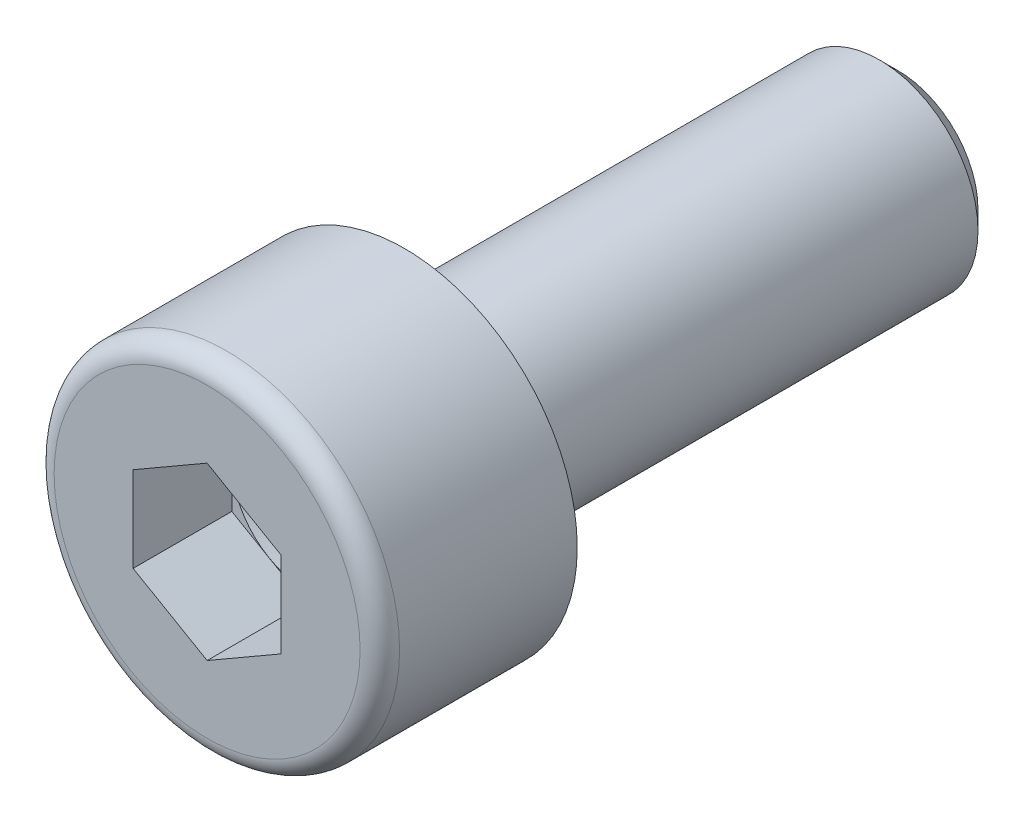
ISO-10303-21;
HEADER;
FILE_DESCRIPTION(('STEP AP214'),'2;1');
FILE_NAME('part.step','',(''),(''),'','','');
FILE_SCHEMA(('AUTOMOTIVE_DESIGN { 1 0 10303 214 1 1 1 1 }'));
ENDSEC;
DATA;
#1=APPLICATION_CONTEXT('core data for automotive mechanical design processes');
#2=APPLICATION_PROTOCOL_DEFINITION('international standard','automotive_design',2000,#1);
#3=PRODUCT_CONTEXT('',#1,'mechanical');
#4=PRODUCT('Part','Part','',(#3));
#5=PRODUCT_RELATED_PRODUCT_CATEGORY('part','',(#4));
#6=PRODUCT_DEFINITION_FORMATION('','',#4);
#7=PRODUCT_DEFINITION_CONTEXT('part definition',#1,'design');
#8=PRODUCT_DEFINITION('design','',#6,#7);
#9=PRODUCT_DEFINITION_SHAPE('','',#8);
#10=(LENGTH_UNIT() NAMED_UNIT(*) SI_UNIT(.MILLI.,.METRE.));
#11=(NAMED_UNIT(*) PLANE_ANGLE_UNIT() SI_UNIT($,.RADIAN.));
#12=(NAMED_UNIT(*) SI_UNIT($,.STERADIAN.) SOLID_ANGLE_UNIT());
#13=UNCERTAINTY_MEASURE_WITH_UNIT(LENGTH_MEASURE(1.E-05),#10,'distance_accuracy_value','');
#14=(GEOMETRIC_REPRESENTATION_CONTEXT(3) GLOBAL_UNCERTAINTY_ASSIGNED_CONTEXT((#13)) GLOBAL_UNIT_ASSIGNED_CONTEXT((#10,
#11,#12)) REPRESENTATION_CONTEXT('',''));
#15=CARTESIAN_POINT('',(0.,0.,0.));
#16=DIRECTION('',(0.,0.,1.));
#17=DIRECTION('',(1.,0.,0.));
#18=AXIS2_PLACEMENT_3D('',#15,#16,#17);
#19=CARTESIAN_POINT('',(0.,0.,-13.6211138875));
#20=DIRECTION('',(0.,0.,1.));
#21=DIRECTION('',(1.,0.,0.));
#22=AXIS2_PLACEMENT_3D('',#19,#20,#21);
#23=CONICAL_SURFACE('',#22,2.,0.785398163397448);
#24=CARTESIAN_POINT('',(0.,0.,-13.6211138875));
#25=DIRECTION('',(0.,0.,1.));
#26=DIRECTION('',(1.,0.,0.));
#27=AXIS2_PLACEMENT_3D('',#24,#25,#26);
#28=CIRCLE('',#27,2.);
#29=CARTESIAN_POINT('',(2.,0.,-13.6211138875));
#30=VERTEX_POINT('',#29);
#31=EDGE_CURVE('E202',#30,#30,#28,.T.);
#32=ORIENTED_EDGE('',*,*,#31,.F.);
#33=EDGE_LOOP('',(#32));
#34=FACE_BOUND('',#33,.T.);
#35=CARTESIAN_POINT('',(0.,0.,-14.));
#36=DIRECTION('',(0.,0.,-1.));
#37=DIRECTION('',(1.,0.,0.));
#38=AXIS2_PLACEMENT_3D('',#35,#36,#37);
#39=CIRCLE('',#38,1.6211138875);
#40=CARTESIAN_POINT('',(1.6211138875,0.,-14.));
#41=VERTEX_POINT('',#40);
#42=EDGE_CURVE('E280',#41,#41,#39,.T.);
#43=ORIENTED_EDGE('',*,*,#42,.F.);
#44=EDGE_LOOP('',(#43));
#45=FACE_BOUND('',#44,.T.);
#46=ADVANCED_FACE('F17',(#34,#45),#23,.T.);
#47=CARTESIAN_POINT('',(0.,0.,-4.2));
#48=DIRECTION('',(0.,0.,1.));
#49=DIRECTION('',(1.,0.,0.));
#50=AXIS2_PLACEMENT_3D('',#47,#48,#49);
#51=TOROIDAL_SURFACE('',#50,2.46487406649083,0.2);
#52=CARTESIAN_POINT('',(0.,0.,-4.));
#53=DIRECTION('',(0.,0.,1.));
#54=DIRECTION('',(1.,0.,0.));
#55=AXIS2_PLACEMENT_3D('',#52,#53,#54);
#56=CIRCLE('',#55,2.46487406649083);
#57=CARTESIAN_POINT('',(2.46487406649083,0.,-4.));
#58=VERTEX_POINT('',#57);
#59=EDGE_CURVE('E206',#58,#58,#56,.T.);
#60=ORIENTED_EDGE('',*,*,#59,.F.);
#61=EDGE_LOOP('',(#60));
#62=FACE_BOUND('',#61,.T.);
#63=CARTESIAN_POINT('',(0.,0.,-4.09922579489519));
#64=DIRECTION('',(0.,0.,-1.));
#65=DIRECTION('',(1.,0.,0.));
#66=AXIS2_PLACEMENT_3D('',#63,#64,#65);
#67=CIRCLE('',#66,2.29211828631114);
#68=CARTESIAN_POINT('',(2.29211828631114,0.,-4.09922579489519));
#69=VERTEX_POINT('',#68);
#70=EDGE_CURVE('E11',#69,#69,#67,.T.);
#71=ORIENTED_EDGE('',*,*,#70,.F.);
#72=EDGE_LOOP('',(#71));
#73=FACE_BOUND('',#72,.T.);
#74=ADVANCED_FACE('F19',(#62,#73),#51,.F.);
#75=CARTESIAN_POINT('',(0.,0.,-4.65406982827));
#76=DIRECTION('',(0.,0.,-1.));
#77=DIRECTION('',(-1.,0.,0.));
#78=AXIS2_PLACEMENT_3D('',#75,#76,#77);
#79=TOROIDAL_SURFACE('',#78,2.2,0.2);
#80=CARTESIAN_POINT('',(0.,0.,-4.65406982827));
#81=DIRECTION('',(0.,0.,-1.));
#82=DIRECTION('',(-1.,0.,0.));
#83=AXIS2_PLACEMENT_3D('',#80,#81,#82);
#84=CIRCLE('',#83,2.);
#85=CARTESIAN_POINT('',(-2.,0.,-4.65406982827));
#86=VERTEX_POINT('',#85);
#87=EDGE_CURVE('E205',#86,#86,#84,.T.);
#88=ORIENTED_EDGE('',*,*,#87,.F.);
#89=EDGE_LOOP('',(#88));
#90=FACE_BOUND('',#89,.T.);
#91=CARTESIAN_POINT('',(0.,0.,-4.55329562316518));
#92=DIRECTION('',(0.,0.,1.));
#93=DIRECTION('',(1.,0.,0.));
#94=AXIS2_PLACEMENT_3D('',#91,#92,#93);
#95=CIRCLE('',#94,2.02724421982031);
#96=CARTESIAN_POINT('',(2.02724421982031,0.,-4.55329562316518));
#97=VERTEX_POINT('',#96);
#98=EDGE_CURVE('E27',#97,#97,#95,.T.);
#99=ORIENTED_EDGE('',*,*,#98,.F.);
#100=EDGE_LOOP('',(#99));
#101=FACE_BOUND('',#100,.T.);
#102=ADVANCED_FACE('F353',(#90,#101),#79,.F.);
#103=CARTESIAN_POINT('',(0.,0.,-4.));
#104=DIRECTION('',(0.,0.,1.));
#105=DIRECTION('',(1.,0.,0.));
#106=AXIS2_PLACEMENT_3D('',#103,#104,#105);
#107=CONICAL_SURFACE('',#106,2.35,0.528074448426359);
#108=ORIENTED_EDGE('',*,*,#70,.T.);
#109=EDGE_LOOP('',(#108));
#110=FACE_BOUND('',#109,.T.);
#111=ORIENTED_EDGE('',*,*,#98,.T.);
#112=EDGE_LOOP('',(#111));
#113=FACE_BOUND('',#112,.T.);
#114=ADVANCED_FACE('F362',(#110,#113),#107,.T.);
#115=CARTESIAN_POINT('',(0.,0.,-2.));
#116=DIRECTION('',(0.,0.,1.));
#117=DIRECTION('',(1.,0.,0.));
#118=AXIS2_PLACEMENT_3D('',#115,#116,#117);
#119=CONICAL_SURFACE('',#118,1.5,1.22173047639603);
#120=CARTESIAN_POINT('',(0.,0.,-2.));
#121=DIRECTION('',(0.,0.,-1.));
#122=DIRECTION('',(-1.,0.,0.));
#123=AXIS2_PLACEMENT_3D('',#120,#121,#122);
#124=CIRCLE('',#123,1.5);
#125=CARTESIAN_POINT('',(-1.5,0.,-2.));
#126=VERTEX_POINT('',#125);
#127=CARTESIAN_POINT('',(-0.75,1.29903810567666,-2.));
#128=VERTEX_POINT('',#127);
#129=EDGE_CURVE('E170',#126,#128,#124,.T.);
#130=ORIENTED_EDGE('',*,*,#129,.F.);
#131=CARTESIAN_POINT('',(0.,0.,-2.));
#132=DIRECTION('',(0.,0.,-1.));
#133=DIRECTION('',(-1.,0.,0.));
#134=AXIS2_PLACEMENT_3D('',#131,#132,#133);
#135=CIRCLE('',#134,1.5);
#136=CARTESIAN_POINT('',(-0.75,-1.29903810567666,-2.));
#137=VERTEX_POINT('',#136);
#138=EDGE_CURVE('E21',#137,#126,#135,.T.);
#139=ORIENTED_EDGE('',*,*,#138,.F.);
#140=CARTESIAN_POINT('',(0.,0.,-2.));
#141=DIRECTION('',(0.,0.,-1.));
#142=DIRECTION('',(-1.,0.,0.));
#143=AXIS2_PLACEMENT_3D('',#140,#141,#142);
#144=CIRCLE('',#143,1.5);
#145=CARTESIAN_POINT('',(0.75,-1.29903810567666,-2.));
#146=VERTEX_POINT('',#145);
#147=EDGE_CURVE('E227',#146,#137,#144,.T.);
#148=ORIENTED_EDGE('',*,*,#147,.F.);
#149=CARTESIAN_POINT('',(0.,0.,-2.));
#150=DIRECTION('',(0.,0.,-1.));
#151=DIRECTION('',(-1.,0.,0.));
#152=AXIS2_PLACEMENT_3D('',#149,#150,#151);
#153=CIRCLE('',#152,1.5);
#154=CARTESIAN_POINT('',(1.5,0.,-2.));
#155=VERTEX_POINT('',#154);
#156=EDGE_CURVE('E219',#155,#146,#153,.T.);
#157=ORIENTED_EDGE('',*,*,#156,.F.);
#158=CARTESIAN_POINT('',(0.,0.,-2.));
#159=DIRECTION('',(0.,0.,-1.));
#160=DIRECTION('',(-1.,0.,0.));
#161=AXIS2_PLACEMENT_3D('',#158,#159,#160);
#162=CIRCLE('',#161,1.5);
#163=CARTESIAN_POINT('',(0.75,1.29903810567666,-2.));
#164=VERTEX_POINT('',#163);
#165=EDGE_CURVE('E199',#164,#155,#162,.T.);
#166=ORIENTED_EDGE('',*,*,#165,.F.);
#167=CARTESIAN_POINT('',(0.,0.,-2.));
#168=DIRECTION('',(0.,0.,-1.));
#169=DIRECTION('',(-1.,0.,0.));
#170=AXIS2_PLACEMENT_3D('',#167,#168,#169);
#171=CIRCLE('',#170,1.5);
#172=EDGE_CURVE('E174',#128,#164,#171,.T.);
#173=ORIENTED_EDGE('',*,*,#172,.F.);
#174=EDGE_LOOP('',(#130,#139,#148,#157,#166,#173));
#175=FACE_BOUND('',#174,.T.);
#176=CARTESIAN_POINT('',(0.,0.,-2.5459553513993));
#177=VERTEX_POINT('',#176);
#178=VERTEX_LOOP('',#177);
#179=FACE_BOUND('',#178,.T.);
#180=ADVANCED_FACE('F171',(#175,#179),#119,.F.);
#181=CARTESIAN_POINT('',(0.,0.,-2.));
#182=DIRECTION('',(0.,0.,1.));
#183=DIRECTION('',(1.,0.,0.));
#184=AXIS2_PLACEMENT_3D('',#181,#182,#183);
#185=PLANE('',#184);
#186=DIRECTION('',(-0.866025403784439,0.5,0.));
#187=VECTOR('',#186,1.);
#188=CARTESIAN_POINT('',(-0.75,-1.29903810567666,-2.));
#189=LINE('',#188,#187);
#190=CARTESIAN_POINT('',(-1.5,-0.866025403784439,-2.));
#191=VERTEX_POINT('',#190);
#192=EDGE_CURVE('E154',#137,#191,#189,.T.);
#193=ORIENTED_EDGE('',*,*,#192,.F.);
#194=ORIENTED_EDGE('',*,*,#138,.T.);
#195=DIRECTION('',(0.,1.,0.));
#196=VECTOR('',#195,1.);
#197=CARTESIAN_POINT('',(-1.5,0.,-2.));
#198=LINE('',#197,#196);
#199=EDGE_CURVE('E152',#191,#126,#198,.T.);
#200=ORIENTED_EDGE('',*,*,#199,.F.);
#201=EDGE_LOOP('',(#193,#194,#200));
#202=FACE_BOUND('',#201,.T.);
#203=ADVANCED_FACE('F151',(#202),#185,.T.);
#204=CARTESIAN_POINT('',(0.721250214161918,-1.31563680226942,-2.));
#205=DIRECTION('',(-0.5,0.866025403784439,0.));
#206=DIRECTION('',(0.,0.,1.));
#207=AXIS2_PLACEMENT_3D('',#204,#205,#206);
#208=PLANE('',#207);
#209=DIRECTION('',(-0.866025403784439,-0.5,0.));
#210=VECTOR('',#209,1.);
#211=CARTESIAN_POINT('',(0.721250214161918,-1.31563680226942,0.));
#212=LINE('',#211,#210);
#213=CARTESIAN_POINT('',(1.5,-0.866025403784439,0.));
#214=VERTEX_POINT('',#213);
#215=CARTESIAN_POINT('',(0.,-1.73205080756888,0.));
#216=VERTEX_POINT('',#215);
#217=EDGE_CURVE('E247',#214,#216,#212,.T.);
#218=ORIENTED_EDGE('',*,*,#217,.F.);
#219=DIRECTION('',(0.,0.,1.));
#220=VECTOR('',#219,1.);
#221=CARTESIAN_POINT('',(1.5,-0.866025403784439,-2.));
#222=LINE('',#221,#220);
#223=CARTESIAN_POINT('',(1.5,-0.866025403784439,-2.));
#224=VERTEX_POINT('',#223);
#225=EDGE_CURVE('E279',#224,#214,#222,.T.);
#226=ORIENTED_EDGE('',*,*,#225,.F.);
#227=DIRECTION('',(-0.866025403784439,-0.5,0.));
#228=VECTOR('',#227,1.);
#229=CARTESIAN_POINT('',(0.721250214161918,-1.31563680226942,-2.));
#230=LINE('',#229,#228);
#231=EDGE_CURVE('E231',#224,#146,#230,.T.);
#232=ORIENTED_EDGE('',*,*,#231,.T.);
#233=DIRECTION('',(-0.866025403784439,-0.5,0.));
#234=VECTOR('',#233,1.);
#235=CARTESIAN_POINT('',(0.721250214161918,-1.31563680226942,-2.));
#236=LINE('',#235,#234);
#237=CARTESIAN_POINT('',(0.,-1.73205080756888,-2.));
#238=VERTEX_POINT('',#237);
#239=EDGE_CURVE('E235',#146,#238,#236,.T.);
#240=ORIENTED_EDGE('',*,*,#239,.T.);
#241=DIRECTION('',(0.,0.,1.));
#242=VECTOR('',#241,1.);
#243=CARTESIAN_POINT('',(0.,-1.73205080756888,-2.));
#244=LINE('',#243,#242);
#245=EDGE_CURVE('E167',#238,#216,#244,.T.);
#246=ORIENTED_EDGE('',*,*,#245,.T.);
#247=EDGE_LOOP('',(#218,#226,#232,#240,#246));
#248=FACE_BOUND('',#247,.T.);
#249=ADVANCED_FACE('F333',(#248),#208,.T.);
#250=CARTESIAN_POINT('',(-0.75,-1.29903810567666,-2.));
#251=DIRECTION('',(0.5,0.866025403784439,0.));
#252=DIRECTION('',(0.,0.,-1.));
#253=AXIS2_PLACEMENT_3D('',#250,#251,#252);
#254=PLANE('',#253);
#255=DIRECTION('',(-0.866025403784439,0.5,0.));
#256=VECTOR('',#255,1.);
#257=CARTESIAN_POINT('',(-0.75,-1.29903810567666,0.));
#258=LINE('',#257,#256);
#259=CARTESIAN_POINT('',(-1.5,-0.866025403784439,0.));
#260=VERTEX_POINT('',#259);
#261=EDGE_CURVE('E252',#216,#260,#258,.T.);
#262=ORIENTED_EDGE('',*,*,#261,.F.);
#263=ORIENTED_EDGE('',*,*,#245,.F.);
#264=DIRECTION('',(-0.866025403784439,0.5,0.));
#265=VECTOR('',#264,1.);
#266=CARTESIAN_POINT('',(-0.75,-1.29903810567666,-2.));
#267=LINE('',#266,#265);
#268=EDGE_CURVE('E195',#238,#137,#267,.T.);
#269=ORIENTED_EDGE('',*,*,#268,.T.);
#270=ORIENTED_EDGE('',*,*,#192,.T.);
#271=DIRECTION('',(0.,0.,1.));
#272=VECTOR('',#271,1.);
#273=CARTESIAN_POINT('',(-1.5,-0.866025403784439,-2.));
#274=LINE('',#273,#272);
#275=EDGE_CURVE('E165',#191,#260,#274,.T.);
#276=ORIENTED_EDGE('',*,*,#275,.T.);
#277=EDGE_LOOP('',(#262,#263,#269,#270,#276));
#278=FACE_BOUND('',#277,.T.);
#279=ADVANCED_FACE('F301',(#278),#254,.T.);
#280=CARTESIAN_POINT('',(-1.5,0.,-2.));
#281=DIRECTION('',(1.,0.,0.));
#282=DIRECTION('',(0.,-1.,0.));
#283=AXIS2_PLACEMENT_3D('',#280,#281,#282);
#284=PLANE('',#283);
#285=DIRECTION('',(0.,1.,0.));
#286=VECTOR('',#285,1.);
#287=CARTESIAN_POINT('',(-1.5,0.,0.));
#288=LINE('',#287,#286);
#289=CARTESIAN_POINT('',(-1.5,0.866025403784439,0.));
#290=VERTEX_POINT('',#289);
#291=EDGE_CURVE('E256',#260,#290,#288,.T.);
#292=ORIENTED_EDGE('',*,*,#291,.F.);
#293=ORIENTED_EDGE('',*,*,#275,.F.);
#294=ORIENTED_EDGE('',*,*,#199,.T.);
#295=DIRECTION('',(0.,1.,0.));
#296=VECTOR('',#295,1.);
#297=CARTESIAN_POINT('',(-1.5,0.,-2.));
#298=LINE('',#297,#296);
#299=CARTESIAN_POINT('',(-1.5,0.866025403784439,-2.));
#300=VERTEX_POINT('',#299);
#301=EDGE_CURVE('E164',#126,#300,#298,.T.);
#302=ORIENTED_EDGE('',*,*,#301,.T.);
#303=DIRECTION('',(0.,0.,1.));
#304=VECTOR('',#303,1.);
#305=CARTESIAN_POINT('',(-1.5,0.866025403784439,-2.));
#306=LINE('',#305,#304);
#307=EDGE_CURVE('E290',#300,#290,#306,.T.);
#308=ORIENTED_EDGE('',*,*,#307,.T.);
#309=EDGE_LOOP('',(#292,#293,#294,#302,#308));
#310=FACE_BOUND('',#309,.T.);
#311=ADVANCED_FACE('F162',(#310),#284,.T.);
#312=CARTESIAN_POINT('',(-0.742562637900043,1.30333206868713,-2.));
#313=DIRECTION('',(0.5,-0.866025403784439,0.));
#314=DIRECTION('',(0.,0.,-1.));
#315=AXIS2_PLACEMENT_3D('',#312,#313,#314);
#316=PLANE('',#315);
#317=DIRECTION('',(0.866025403784439,0.5,0.));
#318=VECTOR('',#317,1.);
#319=CARTESIAN_POINT('',(-0.742562637900043,1.30333206868713,0.));
#320=LINE('',#319,#318);
#321=CARTESIAN_POINT('',(0.,1.73205080756888,0.));
#322=VERTEX_POINT('',#321);
#323=EDGE_CURVE('E260',#290,#322,#320,.T.);
#324=ORIENTED_EDGE('',*,*,#323,.F.);
#325=ORIENTED_EDGE('',*,*,#307,.F.);
#326=DIRECTION('',(0.866025403784439,0.5,0.));
#327=VECTOR('',#326,1.);
#328=CARTESIAN_POINT('',(-0.742562637900043,1.30333206868713,-2.));
#329=LINE('',#328,#327);
#330=EDGE_CURVE('E179',#300,#128,#329,.T.);
#331=ORIENTED_EDGE('',*,*,#330,.T.);
#332=DIRECTION('',(0.866025403784439,0.5,0.));
#333=VECTOR('',#332,1.);
#334=CARTESIAN_POINT('',(-0.742562637900043,1.30333206868713,-2.));
#335=LINE('',#334,#333);
#336=CARTESIAN_POINT('',(0.,1.73205080756888,-2.));
#337=VERTEX_POINT('',#336);
#338=EDGE_CURVE('E190',#128,#337,#335,.T.);
#339=ORIENTED_EDGE('',*,*,#338,.T.);
#340=DIRECTION('',(0.,0.,1.));
#341=VECTOR('',#340,1.);
#342=CARTESIAN_POINT('',(0.,1.73205080756888,-2.));
#343=LINE('',#342,#341);
#344=EDGE_CURVE('E287',#337,#322,#343,.T.);
#345=ORIENTED_EDGE('',*,*,#344,.T.);
#346=EDGE_LOOP('',(#324,#325,#331,#339,#345));
#347=FACE_BOUND('',#346,.T.);
#348=ADVANCED_FACE('F327',(#347),#316,.T.);
#349=CARTESIAN_POINT('',(0.75,1.29903810567666,-2.));
#350=DIRECTION('',(-0.5,-0.866025403784439,0.));
#351=DIRECTION('',(-0.866025403784439,0.5,0.));
#352=AXIS2_PLACEMENT_3D('',#349,#350,#351);
#353=PLANE('',#352);
#354=DIRECTION('',(0.866025403784439,-0.5,0.));
#355=VECTOR('',#354,1.);
#356=CARTESIAN_POINT('',(0.75,1.29903810567666,0.));
#357=LINE('',#356,#355);
#358=CARTESIAN_POINT('',(1.5,0.866025403784439,0.));
#359=VERTEX_POINT('',#358);
#360=EDGE_CURVE('E264',#322,#359,#357,.T.);
#361=ORIENTED_EDGE('',*,*,#360,.F.);
#362=ORIENTED_EDGE('',*,*,#344,.F.);
#363=DIRECTION('',(0.866025403784439,-0.5,0.));
#364=VECTOR('',#363,1.);
#365=CARTESIAN_POINT('',(0.75,1.29903810567666,-2.));
#366=LINE('',#365,#364);
#367=EDGE_CURVE('E200',#337,#164,#366,.T.);
#368=ORIENTED_EDGE('',*,*,#367,.T.);
#369=DIRECTION('',(0.866025403784439,-0.5,0.));
#370=VECTOR('',#369,1.);
#371=CARTESIAN_POINT('',(0.75,1.29903810567666,-2.));
#372=LINE('',#371,#370);
#373=CARTESIAN_POINT('',(1.5,0.866025403784439,-2.));
#374=VERTEX_POINT('',#373);
#375=EDGE_CURVE('E196',#164,#374,#372,.T.);
#376=ORIENTED_EDGE('',*,*,#375,.T.);
#377=DIRECTION('',(0.,0.,1.));
#378=VECTOR('',#377,1.);
#379=CARTESIAN_POINT('',(1.5,0.866025403784439,-2.));
#380=LINE('',#379,#378);
#381=EDGE_CURVE('E276',#374,#359,#380,.T.);
#382=ORIENTED_EDGE('',*,*,#381,.T.);
#383=EDGE_LOOP('',(#361,#362,#368,#376,#382));
#384=FACE_BOUND('',#383,.T.);
#385=ADVANCED_FACE('F320',(#384),#353,.T.);
#386=CARTESIAN_POINT('',(1.5,0.,-2.));
#387=DIRECTION('',(-1.,0.,0.));
#388=DIRECTION('',(0.,0.,1.));
#389=AXIS2_PLACEMENT_3D('',#386,#387,#388);
#390=PLANE('',#389);
#391=DIRECTION('',(0.,-1.,0.));
#392=VECTOR('',#391,1.);
#393=CARTESIAN_POINT('',(1.5,0.,0.));
#394=LINE('',#393,#392);
#395=EDGE_CURVE('E194',#359,#214,#394,.T.);
#396=ORIENTED_EDGE('',*,*,#395,.F.);
#397=ORIENTED_EDGE('',*,*,#381,.F.);
#398=DIRECTION('',(0.,-1.,0.));
#399=VECTOR('',#398,1.);
#400=CARTESIAN_POINT('',(1.5,0.,-2.));
#401=LINE('',#400,#399);
#402=EDGE_CURVE('E209',#374,#155,#401,.T.);
#403=ORIENTED_EDGE('',*,*,#402,.T.);
#404=DIRECTION('',(0.,-1.,0.));
#405=VECTOR('',#404,1.);
#406=CARTESIAN_POINT('',(1.5,0.,-2.));
#407=LINE('',#406,#405);
#408=EDGE_CURVE('E213',#155,#224,#407,.T.);
#409=ORIENTED_EDGE('',*,*,#408,.T.);
#410=ORIENTED_EDGE('',*,*,#225,.T.);
#411=EDGE_LOOP('',(#396,#397,#403,#409,#410));
#412=FACE_BOUND('',#411,.T.);
#413=ADVANCED_FACE('F314',(#412),#390,.T.);
#414=CARTESIAN_POINT('',(-0.508840520662192,0.,-14.));
#415=DIRECTION('',(0.,0.,1.));
#416=DIRECTION('',(1.,0.,0.));
#417=AXIS2_PLACEMENT_3D('',#414,#415,#416);
#418=PLANE('',#417);
#419=ORIENTED_EDGE('',*,*,#42,.T.);
#420=EDGE_LOOP('',(#419));
#421=FACE_BOUND('',#420,.T.);
#422=ADVANCED_FACE('F376',(#421),#418,.F.);
#423=CARTESIAN_POINT('',(0.,0.,-7.));
#424=DIRECTION('',(0.,0.,1.));
#425=DIRECTION('',(1.,0.,0.));
#426=AXIS2_PLACEMENT_3D('',#423,#424,#425);
#427=CYLINDRICAL_SURFACE('',#426,2.);
#428=ORIENTED_EDGE('',*,*,#87,.T.);
#429=EDGE_LOOP('',(#428));
#430=FACE_BOUND('',#429,.T.);
#431=ORIENTED_EDGE('',*,*,#31,.T.);
#432=EDGE_LOOP('',(#431));
#433=FACE_BOUND('',#432,.T.);
#434=ADVANCED_FACE('F372',(#430,#433),#427,.T.);
#435=CARTESIAN_POINT('',(-1.61056634651914,0.,-4.));
#436=DIRECTION('',(0.,0.,1.));
#437=DIRECTION('',(1.,0.,0.));
#438=AXIS2_PLACEMENT_3D('',#435,#436,#437);
#439=PLANE('',#438);
#440=CARTESIAN_POINT('',(0.,0.,-4.));
#441=DIRECTION('',(0.,0.,1.));
#442=DIRECTION('',(1.,0.,0.));
#443=AXIS2_PLACEMENT_3D('',#440,#441,#442);
#444=CIRCLE('',#443,3.5);
#445=CARTESIAN_POINT('',(3.5,0.,-4.));
#446=VERTEX_POINT('',#445);
#447=EDGE_CURVE('E271',#446,#446,#444,.T.);
#448=ORIENTED_EDGE('',*,*,#447,.F.);
#449=EDGE_LOOP('',(#448));
#450=FACE_BOUND('',#449,.T.);
#451=ORIENTED_EDGE('',*,*,#59,.T.);
#452=EDGE_LOOP('',(#451));
#453=FACE_BOUND('',#452,.T.);
#454=ADVANCED_FACE('F375',(#450,#453),#439,.F.);
#455=CARTESIAN_POINT('',(0.,0.,-7.));
#456=DIRECTION('',(0.,0.,1.));
#457=DIRECTION('',(1.,0.,0.));
#458=AXIS2_PLACEMENT_3D('',#455,#456,#457);
#459=CYLINDRICAL_SURFACE('',#458,3.5);
#460=ORIENTED_EDGE('',*,*,#447,.T.);
#461=EDGE_LOOP('',(#460));
#462=FACE_BOUND('',#461,.T.);
#463=CARTESIAN_POINT('',(0.,0.,-0.4));
#464=DIRECTION('',(0.,0.,1.));
#465=DIRECTION('',(1.,0.,0.));
#466=AXIS2_PLACEMENT_3D('',#463,#464,#465);
#467=CIRCLE('',#466,3.5);
#468=CARTESIAN_POINT('',(3.5,0.,-0.4));
#469=VERTEX_POINT('',#468);
#470=EDGE_CURVE('E268',#469,#469,#467,.T.);
#471=ORIENTED_EDGE('',*,*,#470,.F.);
#472=EDGE_LOOP('',(#471));
#473=FACE_BOUND('',#472,.T.);
#474=ADVANCED_FACE('F383',(#462,#473),#459,.T.);
#475=CARTESIAN_POINT('',(0.,0.,-0.4));
#476=DIRECTION('',(0.,0.,1.));
#477=DIRECTION('',(1.,0.,0.));
#478=AXIS2_PLACEMENT_3D('',#475,#476,#477);
#479=TOROIDAL_SURFACE('',#478,3.1,0.4);
#480=CARTESIAN_POINT('',(0.,0.,0.));
#481=DIRECTION('',(0.,0.,1.));
#482=DIRECTION('',(1.,0.,0.));
#483=AXIS2_PLACEMENT_3D('',#480,#481,#482);
#484=CIRCLE('',#483,3.1);
#485=CARTESIAN_POINT('',(3.1,0.,0.));
#486=VERTEX_POINT('',#485);
#487=EDGE_CURVE('E191',#486,#486,#484,.T.);
#488=ORIENTED_EDGE('',*,*,#487,.F.);
#489=EDGE_LOOP('',(#488));
#490=FACE_BOUND('',#489,.T.);
#491=ORIENTED_EDGE('',*,*,#470,.T.);
#492=EDGE_LOOP('',(#491));
#493=FACE_BOUND('',#492,.T.);
#494=ADVANCED_FACE('F407',(#490,#493),#479,.T.);
#495=CARTESIAN_POINT('',(-1.10172582585694,0.,0.));
#496=DIRECTION('',(0.,0.,-1.));
#497=DIRECTION('',(0.,-1.,0.));
#498=AXIS2_PLACEMENT_3D('',#495,#496,#497);
#499=PLANE('',#498);
#500=ORIENTED_EDGE('',*,*,#395,.T.);
#501=ORIENTED_EDGE('',*,*,#217,.T.);
#502=ORIENTED_EDGE('',*,*,#261,.T.);
#503=ORIENTED_EDGE('',*,*,#291,.T.);
#504=ORIENTED_EDGE('',*,*,#323,.T.);
#505=ORIENTED_EDGE('',*,*,#360,.T.);
#506=EDGE_LOOP('',(#500,#501,#502,#503,#504,#505));
#507=FACE_BOUND('',#506,.T.);
#508=ORIENTED_EDGE('',*,*,#487,.T.);
#509=EDGE_LOOP('',(#508));
#510=FACE_BOUND('',#509,.T.);
#511=ADVANCED_FACE('F329',(#507,#510),#499,.F.);
#512=CARTESIAN_POINT('',(0.,0.,-2.));
#513=DIRECTION('',(0.,0.,1.));
#514=DIRECTION('',(1.,0.,0.));
#515=AXIS2_PLACEMENT_3D('',#512,#513,#514);
#516=PLANE('',#515);
#517=ORIENTED_EDGE('',*,*,#239,.F.);
#518=ORIENTED_EDGE('',*,*,#147,.T.);
#519=ORIENTED_EDGE('',*,*,#268,.F.);
#520=EDGE_LOOP('',(#517,#518,#519));
#521=FACE_BOUND('',#520,.T.);
#522=ADVANCED_FACE('F305',(#521),#516,.T.);
#523=CARTESIAN_POINT('',(0.,0.,-2.));
#524=DIRECTION('',(0.,0.,1.));
#525=DIRECTION('',(1.,0.,0.));
#526=AXIS2_PLACEMENT_3D('',#523,#524,#525);
#527=PLANE('',#526);
#528=ORIENTED_EDGE('',*,*,#408,.F.);
#529=ORIENTED_EDGE('',*,*,#156,.T.);
#530=ORIENTED_EDGE('',*,*,#231,.F.);
#531=EDGE_LOOP('',(#528,#529,#530));
#532=FACE_BOUND('',#531,.T.);
#533=ADVANCED_FACE('F310',(#532),#527,.T.);
#534=CARTESIAN_POINT('',(0.,0.,-2.));
#535=DIRECTION('',(0.,0.,1.));
#536=DIRECTION('',(1.,0.,0.));
#537=AXIS2_PLACEMENT_3D('',#534,#535,#536);
#538=PLANE('',#537);
#539=ORIENTED_EDGE('',*,*,#375,.F.);
#540=ORIENTED_EDGE('',*,*,#165,.T.);
#541=ORIENTED_EDGE('',*,*,#402,.F.);
#542=EDGE_LOOP('',(#539,#540,#541));
#543=FACE_BOUND('',#542,.T.);
#544=ADVANCED_FACE('F316',(#543),#538,.T.);
#545=CARTESIAN_POINT('',(0.,0.,-2.));
#546=DIRECTION('',(0.,0.,1.));
#547=DIRECTION('',(1.,0.,0.));
#548=AXIS2_PLACEMENT_3D('',#545,#546,#547);
#549=PLANE('',#548);
#550=ORIENTED_EDGE('',*,*,#338,.F.);
#551=ORIENTED_EDGE('',*,*,#172,.T.);
#552=ORIENTED_EDGE('',*,*,#367,.F.);
#553=EDGE_LOOP('',(#550,#551,#552));
#554=FACE_BOUND('',#553,.T.);
#555=ADVANCED_FACE('F323',(#554),#549,.T.);
#556=CARTESIAN_POINT('',(0.,0.,-2.));
#557=DIRECTION('',(0.,0.,1.));
#558=DIRECTION('',(1.,0.,0.));
#559=AXIS2_PLACEMENT_3D('',#556,#557,#558);
#560=PLANE('',#559);
#561=ORIENTED_EDGE('',*,*,#301,.F.);
#562=ORIENTED_EDGE('',*,*,#129,.T.);
#563=ORIENTED_EDGE('',*,*,#330,.F.);
#564=EDGE_LOOP('',(#561,#562,#563));
#565=FACE_BOUND('',#564,.T.);
#566=ADVANCED_FACE('F181',(#565),#560,.T.);
#567=CLOSED_SHELL('',(#46,#74,#102,#114,#180,#203,#249,#279,#311,#348,#385,#413,#422,#434,#454,
#474,#494,#511,#522,#533,#544,#555,#566));
#568=MANIFOLD_SOLID_BREP('B1',#567);
#569=ADVANCED_BREP_SHAPE_REPRESENTATION('',(#18,#568),#14);
#570=SHAPE_DEFINITION_REPRESENTATION(#9,#569);
ENDSEC;
END-ISO-10303-21;
